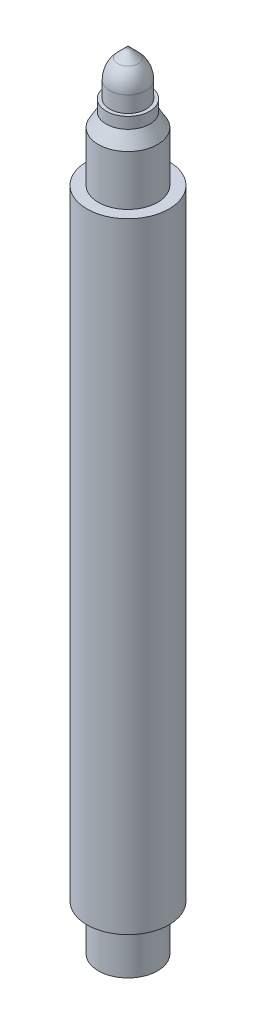
ISO-10303-21;
HEADER;
FILE_DESCRIPTION(('STEP AP214'),'2;1');
FILE_NAME('part.step','',(''),(''),'','','');
FILE_SCHEMA(('AUTOMOTIVE_DESIGN { 1 0 10303 214 1 1 1 1 }'));
ENDSEC;
DATA;
#1=APPLICATION_CONTEXT('core data for automotive mechanical design processes');
#2=APPLICATION_PROTOCOL_DEFINITION('international standard','automotive_design',2000,#1);
#3=PRODUCT_CONTEXT('',#1,'mechanical');
#4=PRODUCT('Part','Part','',(#3));
#5=PRODUCT_RELATED_PRODUCT_CATEGORY('part','',(#4));
#6=PRODUCT_DEFINITION_FORMATION('','',#4);
#7=PRODUCT_DEFINITION_CONTEXT('part definition',#1,'design');
#8=PRODUCT_DEFINITION('design','',#6,#7);
#9=PRODUCT_DEFINITION_SHAPE('','',#8);
#10=(LENGTH_UNIT() NAMED_UNIT(*) SI_UNIT(.MILLI.,.METRE.));
#11=(NAMED_UNIT(*) PLANE_ANGLE_UNIT() SI_UNIT($,.RADIAN.));
#12=(NAMED_UNIT(*) SI_UNIT($,.STERADIAN.) SOLID_ANGLE_UNIT());
#13=UNCERTAINTY_MEASURE_WITH_UNIT(LENGTH_MEASURE(1.E-05),#10,'distance_accuracy_value','');
#14=(GEOMETRIC_REPRESENTATION_CONTEXT(3) GLOBAL_UNCERTAINTY_ASSIGNED_CONTEXT((#13)) GLOBAL_UNIT_ASSIGNED_CONTEXT((#10,
#11,#12)) REPRESENTATION_CONTEXT('',''));
#15=CARTESIAN_POINT('',(0.,0.,0.));
#16=DIRECTION('',(0.,0.,1.));
#17=DIRECTION('',(1.,0.,0.));
#18=AXIS2_PLACEMENT_3D('',#15,#16,#17);
#19=CARTESIAN_POINT('',(0.,-3.70523328968823,0.));
#20=DIRECTION('',(0.,1.,0.));
#21=DIRECTION('',(0.,0.,1.));
#22=AXIS2_PLACEMENT_3D('',#19,#20,#21);
#23=CYLINDRICAL_SURFACE('',#22,4.50000000000011);
#24=CARTESIAN_POINT('',(0.,-81.2300000000012,0.));
#25=DIRECTION('',(0.,1.,0.));
#26=DIRECTION('',(0.,0.,1.));
#27=AXIS2_PLACEMENT_3D('',#24,#25,#26);
#28=CIRCLE('',#27,4.50000000000011);
#29=CARTESIAN_POINT('',(0.,-81.2300000000012,4.50000000000011));
#30=VERTEX_POINT('',#29);
#31=EDGE_CURVE('E105',#30,#30,#28,.T.);
#32=ORIENTED_EDGE('',*,*,#31,.T.);
#33=EDGE_LOOP('',(#32));
#34=FACE_BOUND('',#33,.T.);
#35=CARTESIAN_POINT('',(0.,-13.2300000000012,0.));
#36=DIRECTION('',(0.,1.,0.));
#37=DIRECTION('',(0.,0.,1.));
#38=AXIS2_PLACEMENT_3D('',#35,#36,#37);
#39=CIRCLE('',#38,4.50000000000012);
#40=CARTESIAN_POINT('',(0.,-13.2300000000012,4.50000000000012));
#41=VERTEX_POINT('',#40);
#42=EDGE_CURVE('E119',#41,#41,#39,.T.);
#43=ORIENTED_EDGE('',*,*,#42,.F.);
#44=EDGE_LOOP('',(#43));
#45=FACE_BOUND('',#44,.T.);
#46=ADVANCED_FACE('F35',(#34,#45),#23,.T.);
#47=CARTESIAN_POINT('',(-4.50000000000011,-81.2300000000012,0.));
#48=DIRECTION('',(0.,-1.,0.));
#49=DIRECTION('',(0.,0.,-1.));
#50=AXIS2_PLACEMENT_3D('',#47,#48,#49);
#51=PLANE('',#50);
#52=CARTESIAN_POINT('',(0.,-81.2300000000012,0.));
#53=DIRECTION('',(0.,-1.,0.));
#54=DIRECTION('',(0.,0.,-1.));
#55=AXIS2_PLACEMENT_3D('',#52,#53,#54);
#56=CIRCLE('',#55,3.25);
#57=CARTESIAN_POINT('',(0.,-81.2300000000012,-3.25));
#58=VERTEX_POINT('',#57);
#59=EDGE_CURVE('E102',#58,#58,#56,.T.);
#60=ORIENTED_EDGE('',*,*,#59,.F.);
#61=EDGE_LOOP('',(#60));
#62=FACE_BOUND('',#61,.T.);
#63=ORIENTED_EDGE('',*,*,#31,.F.);
#64=EDGE_LOOP('',(#63));
#65=FACE_BOUND('',#64,.T.);
#66=ADVANCED_FACE('F60',(#62,#65),#51,.T.);
#67=CARTESIAN_POINT('',(-4.50000000000012,-13.2300000000012,0.));
#68=DIRECTION('',(0.,1.,0.));
#69=DIRECTION('',(0.,0.,1.));
#70=AXIS2_PLACEMENT_3D('',#67,#68,#69);
#71=PLANE('',#70);
#72=CARTESIAN_POINT('',(0.,-13.2300000000012,0.));
#73=DIRECTION('',(0.,1.,0.));
#74=DIRECTION('',(0.,0.,1.));
#75=AXIS2_PLACEMENT_3D('',#72,#73,#74);
#76=CIRCLE('',#75,3.25);
#77=CARTESIAN_POINT('',(0.,-13.2300000000012,3.25));
#78=VERTEX_POINT('',#77);
#79=EDGE_CURVE('E97',#78,#78,#76,.T.);
#80=ORIENTED_EDGE('',*,*,#79,.F.);
#81=EDGE_LOOP('',(#80));
#82=FACE_BOUND('',#81,.T.);
#83=ORIENTED_EDGE('',*,*,#42,.T.);
#84=EDGE_LOOP('',(#83));
#85=FACE_BOUND('',#84,.T.);
#86=ADVANCED_FACE('F66',(#82,#85),#71,.T.);
#87=CARTESIAN_POINT('',(0.,-86.2300000000012,0.));
#88=DIRECTION('',(0.,1.,0.));
#89=DIRECTION('',(0.,0.,1.));
#90=AXIS2_PLACEMENT_3D('',#87,#88,#89);
#91=CYLINDRICAL_SURFACE('',#90,3.25);
#92=CARTESIAN_POINT('',(0.,-86.2300000000012,0.));
#93=DIRECTION('',(0.,-1.,0.));
#94=DIRECTION('',(0.,0.,-1.));
#95=AXIS2_PLACEMENT_3D('',#92,#93,#94);
#96=CIRCLE('',#95,3.25);
#97=CARTESIAN_POINT('',(0.,-86.2300000000012,-3.25));
#98=VERTEX_POINT('',#97);
#99=EDGE_CURVE('E115',#98,#98,#96,.T.);
#100=ORIENTED_EDGE('',*,*,#99,.F.);
#101=EDGE_LOOP('',(#100));
#102=FACE_BOUND('',#101,.T.);
#103=ORIENTED_EDGE('',*,*,#59,.T.);
#104=EDGE_LOOP('',(#103));
#105=FACE_BOUND('',#104,.T.);
#106=ADVANCED_FACE('F127',(#102,#105),#91,.T.);
#107=CARTESIAN_POINT('',(0.,-86.2300000000012,0.));
#108=DIRECTION('',(0.,-1.,0.));
#109=DIRECTION('',(0.,0.,-1.));
#110=AXIS2_PLACEMENT_3D('',#107,#108,#109);
#111=PLANE('',#110);
#112=ORIENTED_EDGE('',*,*,#99,.T.);
#113=EDGE_LOOP('',(#112));
#114=FACE_BOUND('',#113,.T.);
#115=ADVANCED_FACE('F86',(#114),#111,.T.);
#116=CARTESIAN_POINT('',(0.,-6.23000000000123,0.));
#117=DIRECTION('',(0.,-1.,0.));
#118=DIRECTION('',(0.,0.,-1.));
#119=AXIS2_PLACEMENT_3D('',#116,#117,#118);
#120=CYLINDRICAL_SURFACE('',#119,3.25);
#121=CARTESIAN_POINT('',(0.,-7.73000000000124,0.));
#122=DIRECTION('',(0.,1.,0.));
#123=DIRECTION('',(0.,0.,1.));
#124=AXIS2_PLACEMENT_3D('',#121,#122,#123);
#125=CIRCLE('',#124,3.25);
#126=CARTESIAN_POINT('',(0.,-7.73000000000124,3.25));
#127=VERTEX_POINT('',#126);
#128=EDGE_CURVE('E92',#127,#127,#125,.F.);
#129=ORIENTED_EDGE('',*,*,#128,.T.);
#130=EDGE_LOOP('',(#129));
#131=FACE_BOUND('',#130,.T.);
#132=ORIENTED_EDGE('',*,*,#79,.T.);
#133=EDGE_LOOP('',(#132));
#134=FACE_BOUND('',#133,.T.);
#135=ADVANCED_FACE('F78',(#131,#134),#120,.T.);
#136=CARTESIAN_POINT('',(0.,-6.23000000000123,0.));
#137=DIRECTION('',(0.,-1.,0.));
#138=DIRECTION('',(0.,0.,-1.));
#139=AXIS2_PLACEMENT_3D('',#136,#137,#138);
#140=CONICAL_SURFACE('',#139,2.38397459621557,0.523598775598294);
#141=ORIENTED_EDGE('',*,*,#128,.F.);
#142=EDGE_LOOP('',(#141));
#143=FACE_BOUND('',#142,.T.);
#144=CARTESIAN_POINT('',(0.,-6.23000000000123,0.));
#145=DIRECTION('',(0.,1.,0.));
#146=DIRECTION('',(0.,0.,1.));
#147=AXIS2_PLACEMENT_3D('',#144,#145,#146);
#148=CIRCLE('',#147,2.38397459621557);
#149=CARTESIAN_POINT('',(0.,-6.23000000000123,2.38397459621557));
#150=VERTEX_POINT('',#149);
#151=EDGE_CURVE('E95',#150,#150,#148,.T.);
#152=ORIENTED_EDGE('',*,*,#151,.F.);
#153=EDGE_LOOP('',(#152));
#154=FACE_BOUND('',#153,.T.);
#155=ADVANCED_FACE('F73',(#143,#154),#140,.T.);
#156=CARTESIAN_POINT('',(0.,-5.00000000000123,0.));
#157=DIRECTION('',(0.,-1.,0.));
#158=DIRECTION('',(0.,0.,-1.));
#159=AXIS2_PLACEMENT_3D('',#156,#157,#158);
#160=CYLINDRICAL_SURFACE('',#159,2.38397459621557);
#161=CARTESIAN_POINT('',(0.,-5.00000000000123,0.));
#162=DIRECTION('',(0.,1.,0.));
#163=DIRECTION('',(0.,0.,1.));
#164=AXIS2_PLACEMENT_3D('',#161,#162,#163);
#165=CIRCLE('',#164,2.38397459621557);
#166=CARTESIAN_POINT('',(0.,-5.00000000000123,2.38397459621557));
#167=VERTEX_POINT('',#166);
#168=EDGE_CURVE('E113',#167,#167,#165,.T.);
#169=ORIENTED_EDGE('',*,*,#168,.F.);
#170=EDGE_LOOP('',(#169));
#171=FACE_BOUND('',#170,.T.);
#172=ORIENTED_EDGE('',*,*,#151,.T.);
#173=EDGE_LOOP('',(#172));
#174=FACE_BOUND('',#173,.T.);
#175=ADVANCED_FACE('F77',(#171,#174),#160,.T.);
#176=CARTESIAN_POINT('',(0.,-5.00000000000123,0.));
#177=DIRECTION('',(0.,1.,0.));
#178=DIRECTION('',(0.,0.,1.));
#179=AXIS2_PLACEMENT_3D('',#176,#177,#178);
#180=PLANE('',#179);
#181=CARTESIAN_POINT('',(0.,-5.00000000000123,0.));
#182=DIRECTION('',(0.,1.,0.));
#183=DIRECTION('',(0.,0.,1.));
#184=AXIS2_PLACEMENT_3D('',#181,#182,#183);
#185=CIRCLE('',#184,2.);
#186=CARTESIAN_POINT('',(0.,-5.00000000000123,2.));
#187=VERTEX_POINT('',#186);
#188=EDGE_CURVE('E99',#187,#187,#185,.T.);
#189=ORIENTED_EDGE('',*,*,#188,.F.);
#190=EDGE_LOOP('',(#189));
#191=FACE_BOUND('',#190,.T.);
#192=ORIENTED_EDGE('',*,*,#168,.T.);
#193=EDGE_LOOP('',(#192));
#194=FACE_BOUND('',#193,.T.);
#195=ADVANCED_FACE('F55',(#191,#194),#180,.T.);
#196=CARTESIAN_POINT('',(0.,5.92438472559061,0.));
#197=DIRECTION('',(0.,1.,0.));
#198=DIRECTION('',(0.,0.,1.));
#199=AXIS2_PLACEMENT_3D('',#196,#197,#198);
#200=CYLINDRICAL_SURFACE('',#199,2.);
#201=CARTESIAN_POINT('',(0.,-3.2426406871205,0.));
#202=DIRECTION('',(0.,-1.,0.));
#203=DIRECTION('',(0.,0.,-1.));
#204=AXIS2_PLACEMENT_3D('',#201,#202,#203);
#205=CIRCLE('',#204,2.);
#206=CARTESIAN_POINT('',(0.,-3.2426406871205,-2.));
#207=VERTEX_POINT('',#206);
#208=EDGE_CURVE('E11',#207,#207,#205,.T.);
#209=ORIENTED_EDGE('',*,*,#208,.T.);
#210=EDGE_LOOP('',(#209));
#211=FACE_BOUND('',#210,.T.);
#212=ORIENTED_EDGE('',*,*,#188,.T.);
#213=EDGE_LOOP('',(#212));
#214=FACE_BOUND('',#213,.T.);
#215=ADVANCED_FACE('F47',(#211,#214),#200,.T.);
#216=CARTESIAN_POINT('',(0.,-1.22818422099158E-12,0.));
#217=DIRECTION('',(0.,-1.,0.));
#218=DIRECTION('',(0.,0.,-1.));
#219=AXIS2_PLACEMENT_3D('',#216,#217,#218);
#220=CONICAL_SURFACE('',#219,0.,0.785398163397449);
#221=CARTESIAN_POINT('',(0.,-1.12132034356086,0.));
#222=DIRECTION('',(0.,1.,0.));
#223=DIRECTION('',(0.,0.,1.));
#224=AXIS2_PLACEMENT_3D('',#221,#222,#223);
#225=CIRCLE('',#224,1.12132034355963);
#226=CARTESIAN_POINT('',(0.,-1.12132034356086,1.12132034355963));
#227=VERTEX_POINT('',#226);
#228=EDGE_CURVE('E42',#227,#227,#225,.T.);
#229=ORIENTED_EDGE('',*,*,#228,.T.);
#230=EDGE_LOOP('',(#229));
#231=FACE_BOUND('',#230,.T.);
#232=CARTESIAN_POINT('',(0.,-1.22818422099158E-12,0.));
#233=VERTEX_POINT('',#232);
#234=VERTEX_LOOP('',#233);
#235=FACE_BOUND('',#234,.T.);
#236=ADVANCED_FACE('F45',(#231,#235),#220,.T.);
#237=CARTESIAN_POINT('',(0.,-3.2426406871205,0.));
#238=DIRECTION('',(0.,-1.,0.));
#239=DIRECTION('',(0.,0.,-1.));
#240=AXIS2_PLACEMENT_3D('',#237,#238,#239);
#241=DEGENERATE_TOROIDAL_SURFACE('',#240,1.,3.,.F.);
#242=ORIENTED_EDGE('',*,*,#208,.F.);
#243=EDGE_LOOP('',(#242));
#244=FACE_BOUND('',#243,.T.);
#245=ORIENTED_EDGE('',*,*,#228,.F.);
#246=EDGE_LOOP('',(#245));
#247=FACE_BOUND('',#246,.T.);
#248=ADVANCED_FACE('F37',(#244,#247),#241,.F.);
#249=CLOSED_SHELL('',(#46,#66,#86,#106,#115,#135,#155,#175,#195,#215,#236,#248));
#250=MANIFOLD_SOLID_BREP('B2',#249);
#251=ADVANCED_BREP_SHAPE_REPRESENTATION('',(#18,#250),#14);
#252=SHAPE_DEFINITION_REPRESENTATION(#9,#251);
ENDSEC;
END-ISO-10303-21;
